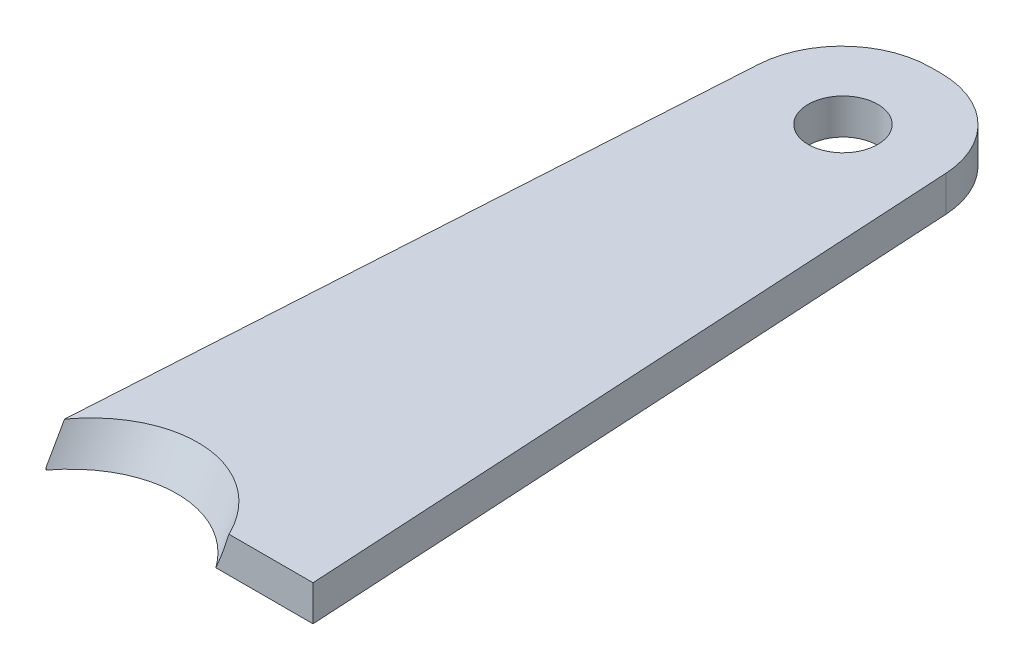
ISO-10303-21;
HEADER;
FILE_DESCRIPTION(('STEP AP214'),'2;1');
FILE_NAME('part.step','',(''),(''),'','','');
FILE_SCHEMA(('AUTOMOTIVE_DESIGN { 1 0 10303 214 1 1 1 1 }'));
ENDSEC;
DATA;
#1=APPLICATION_CONTEXT('core data for automotive mechanical design processes');
#2=APPLICATION_PROTOCOL_DEFINITION('international standard','automotive_design',2000,#1);
#3=PRODUCT_CONTEXT('',#1,'mechanical');
#4=PRODUCT('Part','Part','',(#3));
#5=PRODUCT_RELATED_PRODUCT_CATEGORY('part','',(#4));
#6=PRODUCT_DEFINITION_FORMATION('','',#4);
#7=PRODUCT_DEFINITION_CONTEXT('part definition',#1,'design');
#8=PRODUCT_DEFINITION('design','',#6,#7);
#9=PRODUCT_DEFINITION_SHAPE('','',#8);
#10=(LENGTH_UNIT() NAMED_UNIT(*) SI_UNIT(.MILLI.,.METRE.));
#11=(NAMED_UNIT(*) PLANE_ANGLE_UNIT() SI_UNIT($,.RADIAN.));
#12=(NAMED_UNIT(*) SI_UNIT($,.STERADIAN.) SOLID_ANGLE_UNIT());
#13=UNCERTAINTY_MEASURE_WITH_UNIT(LENGTH_MEASURE(1.E-05),#10,'distance_accuracy_value','');
#14=(GEOMETRIC_REPRESENTATION_CONTEXT(3) GLOBAL_UNCERTAINTY_ASSIGNED_CONTEXT((#13)) GLOBAL_UNIT_ASSIGNED_CONTEXT((#10,
#11,#12)) REPRESENTATION_CONTEXT('',''));
#15=CARTESIAN_POINT('',(0.,0.,0.));
#16=DIRECTION('',(0.,0.,1.));
#17=DIRECTION('',(1.,0.,0.));
#18=AXIS2_PLACEMENT_3D('',#15,#16,#17);
#19=CARTESIAN_POINT('',(15.7255762940305,4.,-74.8434889798303));
#20=DIRECTION('',(0.,-1.,0.));
#21=DIRECTION('',(0.,0.,-1.));
#22=AXIS2_PLACEMENT_3D('',#19,#20,#21);
#23=PLANE('',#22);
#24=CARTESIAN_POINT('',(15.1727945109492,4.,-74.3625495927809));
#25=DIRECTION('',(0.,1.,0.));
#26=DIRECTION('',(0.,0.,1.));
#27=AXIS2_PLACEMENT_3D('',#24,#25,#26);
#28=CIRCLE('',#27,3.91105280336223);
#29=CARTESIAN_POINT('',(15.1727945109492,4.,-70.4514967894187));
#30=VERTEX_POINT('',#29);
#31=EDGE_CURVE('E136',#30,#30,#28,.T.);
#32=ORIENTED_EDGE('',*,*,#31,.F.);
#33=EDGE_LOOP('',(#32));
#34=FACE_BOUND('',#33,.T.);
#35=CARTESIAN_POINT('',(9.58917288596613,4.,6.93002597130665));
#36=DIRECTION('',(0.,-1.,0.));
#37=DIRECTION('',(-0.0889700098833224,0.,0.996034305303468));
#38=AXIS2_PLACEMENT_3D('',#35,#36,#37);
#39=ELLIPSE('',#38,14.1239468635307,12.415);
#40=CARTESIAN_POINT('',(20.5535371319986,4.,0.));
#41=VERTEX_POINT('',#40);
#42=CARTESIAN_POINT('',(0.119164997479138,4.,-1.96096713519427));
#43=VERTEX_POINT('',#42);
#44=EDGE_CURVE('E61',#41,#43,#39,.F.);
#45=ORIENTED_EDGE('',*,*,#44,.F.);
#46=DIRECTION('',(1.,0.,0.));
#47=VECTOR('',#46,1.);
#48=CARTESIAN_POINT('',(0.,4.,0.));
#49=LINE('',#48,#47);
#50=CARTESIAN_POINT('',(30.,4.,0.));
#51=VERTEX_POINT('',#50);
#52=EDGE_CURVE('E37',#41,#51,#49,.T.);
#53=ORIENTED_EDGE('',*,*,#52,.T.);
#54=DIRECTION('',(-0.056803549920191,0.,-0.998385374851046));
#55=VECTOR('',#54,1.);
#56=CARTESIAN_POINT('',(25.7094300425409,4.,-75.4115244790321));
#57=LINE('',#56,#55);
#58=CARTESIAN_POINT('',(25.7094300425409,4.,-75.4115244790321));
#59=VERTEX_POINT('',#58);
#60=EDGE_CURVE('E106',#51,#59,#57,.T.);
#61=ORIENTED_EDGE('',*,*,#60,.T.);
#62=CARTESIAN_POINT('',(15.7255762940305,4.,-74.8434889798303));
#63=DIRECTION('',(0.,1.,0.));
#64=DIRECTION('',(0.,0.,-1.));
#65=AXIS2_PLACEMENT_3D('',#62,#63,#64);
#66=CIRCLE('',#65,10.);
#67=CARTESIAN_POINT('',(15.7255762940304,4.,-84.8434889798303));
#68=VERTEX_POINT('',#67);
#69=EDGE_CURVE('E124',#59,#68,#66,.T.);
#70=ORIENTED_EDGE('',*,*,#69,.T.);
#71=DIRECTION('',(-1.,0.,0.));
#72=VECTOR('',#71,1.);
#73=CARTESIAN_POINT('',(15.1727945109492,4.,-84.8434889798303));
#74=LINE('',#73,#72);
#75=CARTESIAN_POINT('',(14.5665722949634,4.,-84.8434889798303));
#76=VERTEX_POINT('',#75);
#77=EDGE_CURVE('E126',#68,#76,#74,.T.);
#78=ORIENTED_EDGE('',*,*,#77,.T.);
#79=CARTESIAN_POINT('',(14.5665722949633,4.,-74.8434889798303));
#80=DIRECTION('',(0.,1.,0.));
#81=DIRECTION('',(0.,0.,1.));
#82=AXIS2_PLACEMENT_3D('',#79,#80,#81);
#83=CIRCLE('',#82,10.);
#84=CARTESIAN_POINT('',(4.58498535615972,4.,-75.4500548732879));
#85=VERTEX_POINT('',#84);
#86=EDGE_CURVE('E133',#76,#85,#83,.T.);
#87=ORIENTED_EDGE('',*,*,#86,.T.);
#88=DIRECTION('',(-0.0606565893457714,0.,0.998158693880356));
#89=VECTOR('',#88,1.);
#90=CARTESIAN_POINT('',(4.58498535615972,4.,-75.4500548732879));
#91=LINE('',#90,#89);
#92=EDGE_CURVE('E130',#85,#43,#91,.T.);
#93=ORIENTED_EDGE('',*,*,#92,.T.);
#94=EDGE_LOOP('',(#45,#53,#61,#70,#78,#87,#93));
#95=FACE_BOUND('',#94,.T.);
#96=ADVANCED_FACE('F34',(#34,#95),#23,.F.);
#97=CARTESIAN_POINT('',(15.7255762940305,0.,-74.8434889798303));
#98=DIRECTION('',(0.,-1.,0.));
#99=DIRECTION('',(0.,0.,-1.));
#100=AXIS2_PLACEMENT_3D('',#97,#98,#99);
#101=PLANE('',#100);
#102=CARTESIAN_POINT('',(15.1727945109492,0.,-74.3625495927809));
#103=DIRECTION('',(0.,1.,0.));
#104=DIRECTION('',(0.,0.,1.));
#105=AXIS2_PLACEMENT_3D('',#102,#103,#104);
#106=CIRCLE('',#105,3.91105280336223);
#107=CARTESIAN_POINT('',(15.1727945109492,0.,-70.4514967894187));
#108=VERTEX_POINT('',#107);
#109=EDGE_CURVE('E132',#108,#108,#106,.T.);
#110=ORIENTED_EDGE('',*,*,#109,.T.);
#111=EDGE_LOOP('',(#110));
#112=FACE_BOUND('',#111,.T.);
#113=DIRECTION('',(1.,0.,0.));
#114=VECTOR('',#113,1.);
#115=CARTESIAN_POINT('',(0.,0.,0.));
#116=LINE('',#115,#114);
#117=CARTESIAN_POINT('',(19.0833102314625,0.,0.));
#118=VERTEX_POINT('',#117);
#119=CARTESIAN_POINT('',(30.,0.,0.));
#120=VERTEX_POINT('',#119);
#121=EDGE_CURVE('E114',#118,#120,#116,.T.);
#122=ORIENTED_EDGE('',*,*,#121,.F.);
#123=CARTESIAN_POINT('',(9.39612589867058,0.,9.09121963795922));
#124=DIRECTION('',(0.,-1.,0.));
#125=DIRECTION('',(-0.0889700098833224,0.,0.996034305303468));
#126=AXIS2_PLACEMENT_3D('',#123,#124,#125);
#127=ELLIPSE('',#126,14.1239468635307,12.415);
#128=CARTESIAN_POINT('',(0.0759300668101929,0.,0.));
#129=VERTEX_POINT('',#128);
#130=EDGE_CURVE('E51',#118,#129,#127,.F.);
#131=ORIENTED_EDGE('',*,*,#130,.T.);
#132=CARTESIAN_POINT('',(0.,0.,0.));
#133=VERTEX_POINT('',#132);
#134=EDGE_CURVE('E152',#133,#129,#116,.T.);
#135=ORIENTED_EDGE('',*,*,#134,.F.);
#136=DIRECTION('',(-0.0606565893457714,0.,0.998158693880356));
#137=VECTOR('',#136,1.);
#138=CARTESIAN_POINT('',(4.58498535615972,0.,-75.4500548732879));
#139=LINE('',#138,#137);
#140=CARTESIAN_POINT('',(4.58498535615972,0.,-75.4500548732879));
#141=VERTEX_POINT('',#140);
#142=EDGE_CURVE('E156',#141,#133,#139,.T.);
#143=ORIENTED_EDGE('',*,*,#142,.F.);
#144=CARTESIAN_POINT('',(14.5665722949633,0.,-74.8434889798303));
#145=DIRECTION('',(0.,1.,0.));
#146=DIRECTION('',(0.,0.,1.));
#147=AXIS2_PLACEMENT_3D('',#144,#145,#146);
#148=CIRCLE('',#147,10.);
#149=CARTESIAN_POINT('',(14.5665722949634,0.,-84.8434889798303));
#150=VERTEX_POINT('',#149);
#151=EDGE_CURVE('E72',#150,#141,#148,.T.);
#152=ORIENTED_EDGE('',*,*,#151,.F.);
#153=DIRECTION('',(-1.,0.,0.));
#154=VECTOR('',#153,1.);
#155=CARTESIAN_POINT('',(15.1727945109492,0.,-84.8434889798303));
#156=LINE('',#155,#154);
#157=CARTESIAN_POINT('',(15.7255762940304,0.,-84.8434889798303));
#158=VERTEX_POINT('',#157);
#159=EDGE_CURVE('E161',#158,#150,#156,.T.);
#160=ORIENTED_EDGE('',*,*,#159,.F.);
#161=CARTESIAN_POINT('',(15.7255762940305,0.,-74.8434889798303));
#162=DIRECTION('',(0.,1.,0.));
#163=DIRECTION('',(0.,0.,-1.));
#164=AXIS2_PLACEMENT_3D('',#161,#162,#163);
#165=CIRCLE('',#164,10.);
#166=CARTESIAN_POINT('',(25.7094300425409,0.,-75.4115244790321));
#167=VERTEX_POINT('',#166);
#168=EDGE_CURVE('E117',#167,#158,#165,.T.);
#169=ORIENTED_EDGE('',*,*,#168,.F.);
#170=DIRECTION('',(-0.056803549920191,0.,-0.998385374851046));
#171=VECTOR('',#170,1.);
#172=CARTESIAN_POINT('',(25.7094300425409,0.,-75.4115244790321));
#173=LINE('',#172,#171);
#174=EDGE_CURVE('E118',#120,#167,#173,.T.);
#175=ORIENTED_EDGE('',*,*,#174,.F.);
#176=EDGE_LOOP('',(#122,#131,#135,#143,#152,#160,#169,#175));
#177=FACE_BOUND('',#176,.T.);
#178=ADVANCED_FACE('F181',(#112,#177),#101,.T.);
#179=CARTESIAN_POINT('',(4.58498535615972,4.,-75.4500548732879));
#180=DIRECTION('',(0.998158693880356,0.,0.0606565893457715));
#181=DIRECTION('',(0.0606565893457715,0.,-0.998158693880356));
#182=AXIS2_PLACEMENT_3D('',#179,#180,#181);
#183=PLANE('',#182);
#184=CARTESIAN_POINT('',(-21.7236857078194,-644.813204131407,357.482772873646));
#185=DIRECTION('',(0.998158693880356,0.,0.0606565893457715));
#186=DIRECTION('',(-0.0289129721338322,-0.879084138307703,0.47578894251358));
#187=AXIS2_PLACEMENT_3D('',#184,#185,#186);
#188=ELLIPSE('',#187,917.126126831154,12.415);
#189=CARTESIAN_POINT('',(0.,0.211410095048516,0.));
#190=VERTEX_POINT('',#189);
#191=EDGE_CURVE('E43',#43,#190,#188,.F.);
#192=ORIENTED_EDGE('',*,*,#191,.F.);
#193=ORIENTED_EDGE('',*,*,#92,.F.);
#194=DIRECTION('',(0.,-1.,0.));
#195=VECTOR('',#194,1.);
#196=CARTESIAN_POINT('',(4.58498535615972,4.,-75.4500548732879));
#197=LINE('',#196,#195);
#198=EDGE_CURVE('E141',#85,#141,#197,.T.);
#199=ORIENTED_EDGE('',*,*,#198,.T.);
#200=ORIENTED_EDGE('',*,*,#142,.T.);
#201=DIRECTION('',(0.,-1.,0.));
#202=VECTOR('',#201,1.);
#203=CARTESIAN_POINT('',(0.,4.,0.));
#204=LINE('',#203,#202);
#205=EDGE_CURVE('E150',#190,#133,#204,.T.);
#206=ORIENTED_EDGE('',*,*,#205,.F.);
#207=EDGE_LOOP('',(#192,#193,#199,#200,#206));
#208=FACE_BOUND('',#207,.T.);
#209=ADVANCED_FACE('F154',(#208),#183,.F.);
#210=CARTESIAN_POINT('',(0.,4.,0.));
#211=DIRECTION('',(0.,0.,-1.));
#212=DIRECTION('',(-1.,0.,0.));
#213=AXIS2_PLACEMENT_3D('',#210,#211,#212);
#214=PLANE('',#213);
#215=CARTESIAN_POINT('',(10.2081922067625,16.8262933178783,0.));
#216=DIRECTION('',(0.,0.,-1.));
#217=DIRECTION('',(-0.0482056392801837,-0.99883743238907,0.));
#218=AXIS2_PLACEMENT_3D('',#215,#216,#217);
#219=ELLIPSE('',#218,26.1410110189837,12.415);
#220=EDGE_CURVE('E45',#118,#41,#219,.F.);
#221=ORIENTED_EDGE('',*,*,#220,.F.);
#222=ORIENTED_EDGE('',*,*,#121,.T.);
#223=DIRECTION('',(0.,-1.,0.));
#224=VECTOR('',#223,1.);
#225=CARTESIAN_POINT('',(30.,4.,0.));
#226=LINE('',#225,#224);
#227=EDGE_CURVE('E111',#51,#120,#226,.T.);
#228=ORIENTED_EDGE('',*,*,#227,.F.);
#229=ORIENTED_EDGE('',*,*,#52,.F.);
#230=EDGE_LOOP('',(#221,#222,#228,#229));
#231=FACE_BOUND('',#230,.T.);
#232=ADVANCED_FACE('F112',(#231),#214,.F.);
#233=EDGE_CURVE('E11',#190,#129,#219,.F.);
#234=ORIENTED_EDGE('',*,*,#233,.F.);
#235=ORIENTED_EDGE('',*,*,#205,.T.);
#236=ORIENTED_EDGE('',*,*,#134,.T.);
#237=EDGE_LOOP('',(#234,#235,#236));
#238=FACE_BOUND('',#237,.T.);
#239=ADVANCED_FACE('F149',(#238),#214,.F.);
#240=CARTESIAN_POINT('',(25.7094300425409,4.,-75.4115244790321));
#241=DIRECTION('',(-0.998385374851046,0.,0.056803549920191));
#242=DIRECTION('',(0.056803549920191,0.,0.998385374851047));
#243=AXIS2_PLACEMENT_3D('',#240,#241,#242);
#244=PLANE('',#243);
#245=ORIENTED_EDGE('',*,*,#174,.T.);
#246=DIRECTION('',(0.,-1.,0.));
#247=VECTOR('',#246,1.);
#248=CARTESIAN_POINT('',(25.7094300425409,4.,-75.4115244790321));
#249=LINE('',#248,#247);
#250=EDGE_CURVE('E122',#59,#167,#249,.T.);
#251=ORIENTED_EDGE('',*,*,#250,.F.);
#252=ORIENTED_EDGE('',*,*,#60,.F.);
#253=ORIENTED_EDGE('',*,*,#227,.T.);
#254=EDGE_LOOP('',(#245,#251,#252,#253));
#255=FACE_BOUND('',#254,.T.);
#256=ADVANCED_FACE('F120',(#255),#244,.F.);
#257=CARTESIAN_POINT('',(15.7255762940305,4.,-74.8434889798303));
#258=DIRECTION('',(0.,-1.,0.));
#259=DIRECTION('',(0.,0.,-1.));
#260=AXIS2_PLACEMENT_3D('',#257,#258,#259);
#261=CYLINDRICAL_SURFACE('',#260,10.);
#262=ORIENTED_EDGE('',*,*,#168,.T.);
#263=DIRECTION('',(0.,-1.,0.));
#264=VECTOR('',#263,1.);
#265=CARTESIAN_POINT('',(15.7255762940304,4.,-84.8434889798303));
#266=LINE('',#265,#264);
#267=EDGE_CURVE('E162',#68,#158,#266,.T.);
#268=ORIENTED_EDGE('',*,*,#267,.F.);
#269=ORIENTED_EDGE('',*,*,#69,.F.);
#270=ORIENTED_EDGE('',*,*,#250,.T.);
#271=EDGE_LOOP('',(#262,#268,#269,#270));
#272=FACE_BOUND('',#271,.T.);
#273=ADVANCED_FACE('F184',(#272),#261,.T.);
#274=CARTESIAN_POINT('',(15.1727945109492,4.,-84.8434889798303));
#275=DIRECTION('',(0.,0.,1.));
#276=DIRECTION('',(1.,0.,0.));
#277=AXIS2_PLACEMENT_3D('',#274,#275,#276);
#278=PLANE('',#277);
#279=ORIENTED_EDGE('',*,*,#159,.T.);
#280=DIRECTION('',(0.,-1.,0.));
#281=VECTOR('',#280,1.);
#282=CARTESIAN_POINT('',(14.5665722949634,4.,-84.8434889798303));
#283=LINE('',#282,#281);
#284=EDGE_CURVE('E139',#76,#150,#283,.T.);
#285=ORIENTED_EDGE('',*,*,#284,.F.);
#286=ORIENTED_EDGE('',*,*,#77,.F.);
#287=ORIENTED_EDGE('',*,*,#267,.T.);
#288=EDGE_LOOP('',(#279,#285,#286,#287));
#289=FACE_BOUND('',#288,.T.);
#290=ADVANCED_FACE('F178',(#289),#278,.F.);
#291=CARTESIAN_POINT('',(14.5665722949633,4.,-74.8434889798303));
#292=DIRECTION('',(0.,-1.,0.));
#293=DIRECTION('',(0.,0.,-1.));
#294=AXIS2_PLACEMENT_3D('',#291,#292,#293);
#295=CYLINDRICAL_SURFACE('',#294,10.);
#296=ORIENTED_EDGE('',*,*,#151,.T.);
#297=ORIENTED_EDGE('',*,*,#198,.F.);
#298=ORIENTED_EDGE('',*,*,#86,.F.);
#299=ORIENTED_EDGE('',*,*,#284,.T.);
#300=EDGE_LOOP('',(#296,#297,#298,#299));
#301=FACE_BOUND('',#300,.T.);
#302=ADVANCED_FACE('F179',(#301),#295,.T.);
#303=CARTESIAN_POINT('',(15.1727945109492,4.,-74.3625495927809));
#304=DIRECTION('',(0.,-1.,0.));
#305=DIRECTION('',(0.,0.,-1.));
#306=AXIS2_PLACEMENT_3D('',#303,#304,#305);
#307=CYLINDRICAL_SURFACE('',#306,3.91105280336223);
#308=ORIENTED_EDGE('',*,*,#31,.T.);
#309=EDGE_LOOP('',(#308));
#310=FACE_BOUND('',#309,.T.);
#311=ORIENTED_EDGE('',*,*,#109,.F.);
#312=EDGE_LOOP('',(#311));
#313=FACE_BOUND('',#312,.T.);
#314=ADVANCED_FACE('F202',(#310,#313),#307,.F.);
#315=CARTESIAN_POINT('',(11.1434363154431,36.2048730467356,-10.4702159446821));
#316=DIRECTION('',(-0.0424222487246594,-0.879003590140705,0.47492424799424));
#317=DIRECTION('',(0.0459979662045443,-0.476566446454619,-0.877934285250703));
#318=AXIS2_PLACEMENT_3D('',#315,#316,#317);
#319=CYLINDRICAL_SURFACE('',#318,12.415);
#320=ORIENTED_EDGE('',*,*,#220,.T.);
#321=ORIENTED_EDGE('',*,*,#44,.T.);
#322=ORIENTED_EDGE('',*,*,#191,.T.);
#323=ORIENTED_EDGE('',*,*,#233,.T.);
#324=ORIENTED_EDGE('',*,*,#130,.F.);
#325=EDGE_LOOP('',(#320,#321,#322,#323,#324));
#326=FACE_BOUND('',#325,.T.);
#327=ADVANCED_FACE('F143',(#326),#319,.F.);
#328=CLOSED_SHELL('',(#96,#178,#209,#232,#239,#256,#273,#290,#302,#314,#327));
#329=MANIFOLD_SOLID_BREP('B2',#328);
#330=ADVANCED_BREP_SHAPE_REPRESENTATION('',(#18,#329),#14);
#331=SHAPE_DEFINITION_REPRESENTATION(#9,#330);
ENDSEC;
END-ISO-10303-21;
